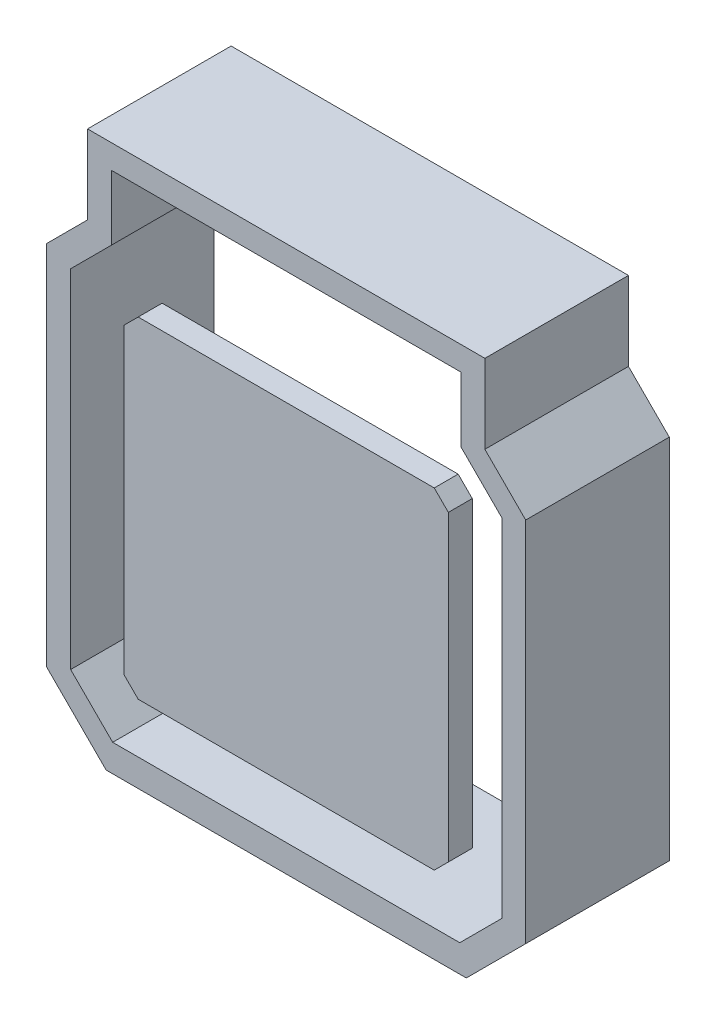
ISO-10303-21;
HEADER;
FILE_DESCRIPTION(('STEP AP214'),'2;1');
FILE_NAME('part.step','',(''),(''),'','','');
FILE_SCHEMA(('AUTOMOTIVE_DESIGN { 1 0 10303 214 1 1 1 1 }'));
ENDSEC;
DATA;
#1=APPLICATION_CONTEXT('core data for automotive mechanical design processes');
#2=APPLICATION_PROTOCOL_DEFINITION('international standard','automotive_design',2000,#1);
#3=PRODUCT_CONTEXT('',#1,'mechanical');
#4=PRODUCT('Part','Part','',(#3));
#5=PRODUCT_RELATED_PRODUCT_CATEGORY('part','',(#4));
#6=PRODUCT_DEFINITION_FORMATION('','',#4);
#7=PRODUCT_DEFINITION_CONTEXT('part definition',#1,'design');
#8=PRODUCT_DEFINITION('design','',#6,#7);
#9=PRODUCT_DEFINITION_SHAPE('','',#8);
#10=(LENGTH_UNIT() NAMED_UNIT(*) SI_UNIT(.MILLI.,.METRE.));
#11=(NAMED_UNIT(*) PLANE_ANGLE_UNIT() SI_UNIT($,.RADIAN.));
#12=(NAMED_UNIT(*) SI_UNIT($,.STERADIAN.) SOLID_ANGLE_UNIT());
#13=UNCERTAINTY_MEASURE_WITH_UNIT(LENGTH_MEASURE(1.E-05),#10,'distance_accuracy_value','');
#14=(GEOMETRIC_REPRESENTATION_CONTEXT(3) GLOBAL_UNCERTAINTY_ASSIGNED_CONTEXT((#13)) GLOBAL_UNIT_ASSIGNED_CONTEXT((#10,
#11,#12)) REPRESENTATION_CONTEXT('',''));
#15=CARTESIAN_POINT('',(0.,0.,0.));
#16=DIRECTION('',(0.,0.,1.));
#17=DIRECTION('',(1.,0.,0.));
#18=AXIS2_PLACEMENT_3D('',#15,#16,#17);
#19=CARTESIAN_POINT('',(0.,0.,0.));
#20=DIRECTION('',(0.,0.,-1.));
#21=DIRECTION('',(-1.,0.,0.));
#22=AXIS2_PLACEMENT_3D('',#19,#20,#21);
#23=PLANE('',#22);
#24=DIRECTION('',(0.,1.,0.));
#25=VECTOR('',#24,1.);
#26=CARTESIAN_POINT('',(30.0265122042927,-23.0001046020526,0.));
#27=LINE('',#26,#25);
#28=CARTESIAN_POINT('',(30.0265122042927,-23.0001046020526,0.));
#29=VERTEX_POINT('',#28);
#30=CARTESIAN_POINT('',(30.0265122042927,23.0001046020527,0.));
#31=VERTEX_POINT('',#30);
#32=EDGE_CURVE('E467',#29,#31,#27,.T.);
#33=ORIENTED_EDGE('',*,*,#32,.T.);
#34=DIRECTION('',(-0.707106781186551,0.707106781186544,0.));
#35=VECTOR('',#34,1.);
#36=CARTESIAN_POINT('',(30.0265122042927,23.0001046020527,0.));
#37=LINE('',#36,#35);
#38=CARTESIAN_POINT('',(24.907301525,28.1193152813454,0.));
#39=VERTEX_POINT('',#38);
#40=EDGE_CURVE('E464',#31,#39,#37,.T.);
#41=ORIENTED_EDGE('',*,*,#40,.T.);
#42=DIRECTION('',(0.,-1.,0.));
#43=VECTOR('',#42,1.);
#44=CARTESIAN_POINT('',(24.907301525,38.,0.));
#45=LINE('',#44,#43);
#46=CARTESIAN_POINT('',(24.907301525,38.,0.));
#47=VERTEX_POINT('',#46);
#48=EDGE_CURVE('E461',#47,#39,#45,.T.);
#49=ORIENTED_EDGE('',*,*,#48,.F.);
#50=DIRECTION('',(1.,0.,0.));
#51=VECTOR('',#50,1.);
#52=CARTESIAN_POINT('',(-24.907301525,38.,0.));
#53=LINE('',#52,#51);
#54=CARTESIAN_POINT('',(-24.907301525,38.,0.));
#55=VERTEX_POINT('',#54);
#56=EDGE_CURVE('E459',#55,#47,#53,.T.);
#57=ORIENTED_EDGE('',*,*,#56,.F.);
#58=DIRECTION('',(0.,1.,0.));
#59=VECTOR('',#58,1.);
#60=CARTESIAN_POINT('',(-24.907301525,28.1193152813457,0.));
#61=LINE('',#60,#59);
#62=CARTESIAN_POINT('',(-24.907301525,28.1193152813457,0.));
#63=VERTEX_POINT('',#62);
#64=EDGE_CURVE('E457',#63,#55,#61,.T.);
#65=ORIENTED_EDGE('',*,*,#64,.F.);
#66=DIRECTION('',(-0.707106781186544,-0.707106781186551,0.));
#67=VECTOR('',#66,1.);
#68=CARTESIAN_POINT('',(-24.907301525,28.1193152813457,0.));
#69=LINE('',#68,#67);
#70=CARTESIAN_POINT('',(-30.0265122042929,23.0001046020527,0.));
#71=VERTEX_POINT('',#70);
#72=EDGE_CURVE('E454',#63,#71,#69,.T.);
#73=ORIENTED_EDGE('',*,*,#72,.T.);
#74=DIRECTION('',(0.,-1.,0.));
#75=VECTOR('',#74,1.);
#76=CARTESIAN_POINT('',(-30.0265122042929,23.0001046020527,0.));
#77=LINE('',#76,#75);
#78=CARTESIAN_POINT('',(-30.0265122042929,-23.0001046020527,0.));
#79=VERTEX_POINT('',#78);
#80=EDGE_CURVE('E451',#71,#79,#77,.T.);
#81=ORIENTED_EDGE('',*,*,#80,.T.);
#82=DIRECTION('',(0.707106781186551,-0.707106781186544,0.));
#83=VECTOR('',#82,1.);
#84=CARTESIAN_POINT('',(-30.0265122042929,-23.0001046020527,0.));
#85=LINE('',#84,#83);
#86=CARTESIAN_POINT('',(-22.5766168063456,-30.45,0.));
#87=VERTEX_POINT('',#86);
#88=EDGE_CURVE('E448',#79,#87,#85,.T.);
#89=ORIENTED_EDGE('',*,*,#88,.T.);
#90=DIRECTION('',(1.,0.,0.));
#91=VECTOR('',#90,1.);
#92=CARTESIAN_POINT('',(-22.5766168063456,-30.45,0.));
#93=LINE('',#92,#91);
#94=CARTESIAN_POINT('',(22.5766168063454,-30.45,0.));
#95=VERTEX_POINT('',#94);
#96=EDGE_CURVE('E445',#87,#95,#93,.T.);
#97=ORIENTED_EDGE('',*,*,#96,.T.);
#98=DIRECTION('',(0.707106781186544,0.707106781186551,0.));
#99=VECTOR('',#98,1.);
#100=CARTESIAN_POINT('',(22.5766168063454,-30.45,0.));
#101=LINE('',#100,#99);
#102=EDGE_CURVE('E423',#95,#29,#101,.T.);
#103=ORIENTED_EDGE('',*,*,#102,.T.);
#104=EDGE_LOOP('',(#33,#41,#49,#57,#65,#73,#81,#89,#97,#103));
#105=FACE_BOUND('',#104,.T.);
#106=DIRECTION('',(-0.707106781186545,-0.70710678118655,0.));
#107=VECTOR('',#106,1.);
#108=CARTESIAN_POINT('',(27.0265122042927,-21.7574639149334,0.));
#109=LINE('',#108,#107);
#110=CARTESIAN_POINT('',(27.0265122042927,-21.7574639149334,0.));
#111=VERTEX_POINT('',#110);
#112=CARTESIAN_POINT('',(21.7574639149342,-27.0265122042919,0.));
#113=VERTEX_POINT('',#112);
#114=EDGE_CURVE('E13',#111,#113,#109,.T.);
#115=ORIENTED_EDGE('',*,*,#114,.T.);
#116=DIRECTION('',(-1.,0.,0.));
#117=VECTOR('',#116,1.);
#118=CARTESIAN_POINT('',(21.7574639149342,-27.0265122042919,0.));
#119=LINE('',#118,#117);
#120=CARTESIAN_POINT('',(-21.7574639149345,-27.0265122042919,0.));
#121=VERTEX_POINT('',#120);
#122=EDGE_CURVE('E221',#113,#121,#119,.T.);
#123=ORIENTED_EDGE('',*,*,#122,.T.);
#124=DIRECTION('',(-0.707106781186542,0.707106781186553,0.));
#125=VECTOR('',#124,1.);
#126=CARTESIAN_POINT('',(-21.7574639149345,-27.0265122042919,0.));
#127=LINE('',#126,#125);
#128=CARTESIAN_POINT('',(-27.0265122042929,-21.7574639149334,0.));
#129=VERTEX_POINT('',#128);
#130=EDGE_CURVE('E351',#121,#129,#127,.T.);
#131=ORIENTED_EDGE('',*,*,#130,.T.);
#132=DIRECTION('',(0.,-1.,0.));
#133=VECTOR('',#132,1.);
#134=CARTESIAN_POINT('',(-27.0265122042929,21.7574639149333,0.));
#135=LINE('',#134,#133);
#136=CARTESIAN_POINT('',(-27.0265122042929,21.7574639149333,0.));
#137=VERTEX_POINT('',#136);
#138=EDGE_CURVE('E505',#137,#129,#135,.T.);
#139=ORIENTED_EDGE('',*,*,#138,.F.);
#140=DIRECTION('',(-0.707106781186533,-0.707106781186562,0.));
#141=VECTOR('',#140,1.);
#142=CARTESIAN_POINT('',(-21.907301525,26.8766745942264,0.));
#143=LINE('',#142,#141);
#144=CARTESIAN_POINT('',(-21.907301525,26.8766745942264,0.));
#145=VERTEX_POINT('',#144);
#146=EDGE_CURVE('E502',#145,#137,#143,.T.);
#147=ORIENTED_EDGE('',*,*,#146,.F.);
#148=DIRECTION('',(0.,1.,0.));
#149=VECTOR('',#148,1.);
#150=CARTESIAN_POINT('',(-21.907301525,26.8766745942264,0.));
#151=LINE('',#150,#149);
#152=CARTESIAN_POINT('',(-21.907301525,35.,0.));
#153=VERTEX_POINT('',#152);
#154=EDGE_CURVE('E499',#145,#153,#151,.T.);
#155=ORIENTED_EDGE('',*,*,#154,.T.);
#156=DIRECTION('',(1.,0.,0.));
#157=VECTOR('',#156,1.);
#158=CARTESIAN_POINT('',(-21.907301525,35.,0.));
#159=LINE('',#158,#157);
#160=CARTESIAN_POINT('',(21.907301525,35.,0.));
#161=VERTEX_POINT('',#160);
#162=EDGE_CURVE('E496',#153,#161,#159,.T.);
#163=ORIENTED_EDGE('',*,*,#162,.T.);
#164=DIRECTION('',(0.,-1.,0.));
#165=VECTOR('',#164,1.);
#166=CARTESIAN_POINT('',(21.907301525,35.,0.));
#167=LINE('',#166,#165);
#168=CARTESIAN_POINT('',(21.907301525,26.8766745942261,0.));
#169=VERTEX_POINT('',#168);
#170=EDGE_CURVE('E493',#161,#169,#167,.T.);
#171=ORIENTED_EDGE('',*,*,#170,.T.);
#172=DIRECTION('',(-0.70710678118655,0.707106781186545,0.));
#173=VECTOR('',#172,1.);
#174=CARTESIAN_POINT('',(27.0265122042927,21.7574639149334,0.));
#175=LINE('',#174,#173);
#176=CARTESIAN_POINT('',(27.0265122042927,21.7574639149334,0.));
#177=VERTEX_POINT('',#176);
#178=EDGE_CURVE('E490',#177,#169,#175,.T.);
#179=ORIENTED_EDGE('',*,*,#178,.F.);
#180=DIRECTION('',(0.,1.,0.));
#181=VECTOR('',#180,1.);
#182=CARTESIAN_POINT('',(27.0265122042927,-21.7574639149334,0.));
#183=LINE('',#182,#181);
#184=EDGE_CURVE('E487',#111,#177,#183,.T.);
#185=ORIENTED_EDGE('',*,*,#184,.F.);
#186=EDGE_LOOP('',(#115,#123,#131,#139,#147,#155,#163,#171,#179,#185));
#187=FACE_BOUND('',#186,.T.);
#188=ADVANCED_FACE('F213',(#105,#187),#23,.F.);
#189=CARTESIAN_POINT('',(30.0265122042927,-23.0001046020526,-3.));
#190=DIRECTION('',(1.,0.,0.));
#191=DIRECTION('',(0.,1.,0.));
#192=AXIS2_PLACEMENT_3D('',#189,#190,#191);
#193=PLANE('',#192);
#194=ORIENTED_EDGE('',*,*,#32,.F.);
#195=DIRECTION('',(0.,0.,1.));
#196=VECTOR('',#195,1.);
#197=CARTESIAN_POINT('',(30.0265122042927,-23.0001046020526,-3.));
#198=LINE('',#197,#196);
#199=CARTESIAN_POINT('',(30.0265122042927,-23.0001046020526,-18.));
#200=VERTEX_POINT('',#199);
#201=EDGE_CURVE('E420',#200,#29,#198,.T.);
#202=ORIENTED_EDGE('',*,*,#201,.F.);
#203=DIRECTION('',(0.,-1.,0.));
#204=VECTOR('',#203,1.);
#205=CARTESIAN_POINT('',(30.0265122042927,0.,-18.));
#206=LINE('',#205,#204);
#207=CARTESIAN_POINT('',(30.0265122042927,23.0001046020527,-18.));
#208=VERTEX_POINT('',#207);
#209=EDGE_CURVE('E393',#208,#200,#206,.T.);
#210=ORIENTED_EDGE('',*,*,#209,.F.);
#211=DIRECTION('',(0.,0.,1.));
#212=VECTOR('',#211,1.);
#213=CARTESIAN_POINT('',(30.0265122042927,23.0001046020527,-3.));
#214=LINE('',#213,#212);
#215=EDGE_CURVE('E421',#208,#31,#214,.T.);
#216=ORIENTED_EDGE('',*,*,#215,.T.);
#217=EDGE_LOOP('',(#194,#202,#210,#216));
#218=FACE_BOUND('',#217,.T.);
#219=ADVANCED_FACE('F546',(#218),#193,.T.);
#220=CARTESIAN_POINT('',(22.5766168063454,-30.45,-3.));
#221=DIRECTION('',(0.707106781186551,-0.707106781186544,0.));
#222=DIRECTION('',(0.707106781186544,0.707106781186551,0.));
#223=AXIS2_PLACEMENT_3D('',#220,#221,#222);
#224=PLANE('',#223);
#225=ORIENTED_EDGE('',*,*,#102,.F.);
#226=DIRECTION('',(0.,0.,1.));
#227=VECTOR('',#226,1.);
#228=CARTESIAN_POINT('',(22.5766168063454,-30.45,-3.));
#229=LINE('',#228,#227);
#230=CARTESIAN_POINT('',(22.5766168063454,-30.45,-18.));
#231=VERTEX_POINT('',#230);
#232=EDGE_CURVE('E440',#231,#95,#229,.T.);
#233=ORIENTED_EDGE('',*,*,#232,.F.);
#234=DIRECTION('',(-0.707106781186544,-0.707106781186551,0.));
#235=VECTOR('',#234,1.);
#236=CARTESIAN_POINT('',(26.5133084031728,-26.5133084031726,-18.));
#237=LINE('',#236,#235);
#238=EDGE_CURVE('E396',#200,#231,#237,.T.);
#239=ORIENTED_EDGE('',*,*,#238,.F.);
#240=ORIENTED_EDGE('',*,*,#201,.T.);
#241=EDGE_LOOP('',(#225,#233,#239,#240));
#242=FACE_BOUND('',#241,.T.);
#243=ADVANCED_FACE('F552',(#242),#224,.T.);
#244=CARTESIAN_POINT('',(-22.5766168063456,-30.45,-3.));
#245=DIRECTION('',(0.,-1.,0.));
#246=DIRECTION('',(1.,0.,0.));
#247=AXIS2_PLACEMENT_3D('',#244,#245,#246);
#248=PLANE('',#247);
#249=ORIENTED_EDGE('',*,*,#96,.F.);
#250=DIRECTION('',(0.,0.,1.));
#251=VECTOR('',#250,1.);
#252=CARTESIAN_POINT('',(-22.5766168063456,-30.45,-3.));
#253=LINE('',#252,#251);
#254=CARTESIAN_POINT('',(-22.5766168063456,-30.45,-18.));
#255=VERTEX_POINT('',#254);
#256=EDGE_CURVE('E438',#255,#87,#253,.T.);
#257=ORIENTED_EDGE('',*,*,#256,.F.);
#258=DIRECTION('',(-1.,0.,0.));
#259=VECTOR('',#258,1.);
#260=CARTESIAN_POINT('',(0.,-30.45,-18.));
#261=LINE('',#260,#259);
#262=EDGE_CURVE('E399',#231,#255,#261,.T.);
#263=ORIENTED_EDGE('',*,*,#262,.F.);
#264=ORIENTED_EDGE('',*,*,#232,.T.);
#265=EDGE_LOOP('',(#249,#257,#263,#264));
#266=FACE_BOUND('',#265,.T.);
#267=ADVANCED_FACE('F664',(#266),#248,.T.);
#268=CARTESIAN_POINT('',(-30.0265122042929,-23.0001046020527,-3.));
#269=DIRECTION('',(-0.707106781186544,-0.70710678118655,0.));
#270=DIRECTION('',(0.707106781186551,-0.707106781186545,0.));
#271=AXIS2_PLACEMENT_3D('',#268,#269,#270);
#272=PLANE('',#271);
#273=ORIENTED_EDGE('',*,*,#88,.F.);
#274=DIRECTION('',(0.,0.,1.));
#275=VECTOR('',#274,1.);
#276=CARTESIAN_POINT('',(-30.0265122042929,-23.0001046020527,-3.));
#277=LINE('',#276,#275);
#278=CARTESIAN_POINT('',(-30.0265122042929,-23.0001046020527,-18.));
#279=VERTEX_POINT('',#278);
#280=EDGE_CURVE('E436',#279,#79,#277,.T.);
#281=ORIENTED_EDGE('',*,*,#280,.F.);
#282=DIRECTION('',(-0.707106781186551,0.707106781186544,0.));
#283=VECTOR('',#282,1.);
#284=CARTESIAN_POINT('',(-26.5133084031727,-26.5133084031729,-18.));
#285=LINE('',#284,#283);
#286=EDGE_CURVE('E402',#255,#279,#285,.T.);
#287=ORIENTED_EDGE('',*,*,#286,.F.);
#288=ORIENTED_EDGE('',*,*,#256,.T.);
#289=EDGE_LOOP('',(#273,#281,#287,#288));
#290=FACE_BOUND('',#289,.T.);
#291=ADVANCED_FACE('F661',(#290),#272,.T.);
#292=CARTESIAN_POINT('',(-30.0265122042929,23.0001046020527,-3.));
#293=DIRECTION('',(-1.,0.,0.));
#294=DIRECTION('',(0.,0.,1.));
#295=AXIS2_PLACEMENT_3D('',#292,#293,#294);
#296=PLANE('',#295);
#297=ORIENTED_EDGE('',*,*,#80,.F.);
#298=DIRECTION('',(0.,0.,1.));
#299=VECTOR('',#298,1.);
#300=CARTESIAN_POINT('',(-30.0265122042929,23.0001046020527,-3.));
#301=LINE('',#300,#299);
#302=CARTESIAN_POINT('',(-30.0265122042929,23.0001046020527,-18.));
#303=VERTEX_POINT('',#302);
#304=EDGE_CURVE('E434',#303,#71,#301,.T.);
#305=ORIENTED_EDGE('',*,*,#304,.F.);
#306=DIRECTION('',(0.,1.,0.));
#307=VECTOR('',#306,1.);
#308=CARTESIAN_POINT('',(-30.0265122042929,0.,-18.));
#309=LINE('',#308,#307);
#310=EDGE_CURVE('E405',#279,#303,#309,.T.);
#311=ORIENTED_EDGE('',*,*,#310,.F.);
#312=ORIENTED_EDGE('',*,*,#280,.T.);
#313=EDGE_LOOP('',(#297,#305,#311,#312));
#314=FACE_BOUND('',#313,.T.);
#315=ADVANCED_FACE('F657',(#314),#296,.T.);
#316=CARTESIAN_POINT('',(-24.907301525,28.1193152813457,-3.));
#317=DIRECTION('',(-0.707106781186551,0.707106781186544,0.));
#318=DIRECTION('',(-0.707106781186544,-0.707106781186551,0.));
#319=AXIS2_PLACEMENT_3D('',#316,#317,#318);
#320=PLANE('',#319);
#321=ORIENTED_EDGE('',*,*,#72,.F.);
#322=DIRECTION('',(0.,0.,1.));
#323=VECTOR('',#322,1.);
#324=CARTESIAN_POINT('',(-24.907301525,28.1193152813457,-3.));
#325=LINE('',#324,#323);
#326=CARTESIAN_POINT('',(-24.907301525,28.1193152813457,-18.));
#327=VERTEX_POINT('',#326);
#328=EDGE_CURVE('E432',#327,#63,#325,.T.);
#329=ORIENTED_EDGE('',*,*,#328,.F.);
#330=DIRECTION('',(0.707106781186544,0.707106781186551,0.));
#331=VECTOR('',#330,1.);
#332=CARTESIAN_POINT('',(-26.513308403173,26.5133084031727,-18.));
#333=LINE('',#332,#331);
#334=EDGE_CURVE('E408',#303,#327,#333,.T.);
#335=ORIENTED_EDGE('',*,*,#334,.F.);
#336=ORIENTED_EDGE('',*,*,#304,.T.);
#337=EDGE_LOOP('',(#321,#329,#335,#336));
#338=FACE_BOUND('',#337,.T.);
#339=ADVANCED_FACE('F653',(#338),#320,.T.);
#340=CARTESIAN_POINT('',(-24.907301525,28.1193152813457,-3.));
#341=DIRECTION('',(1.,0.,0.));
#342=DIRECTION('',(0.,0.,-1.));
#343=AXIS2_PLACEMENT_3D('',#340,#341,#342);
#344=PLANE('',#343);
#345=ORIENTED_EDGE('',*,*,#64,.T.);
#346=DIRECTION('',(0.,0.,1.));
#347=VECTOR('',#346,1.);
#348=CARTESIAN_POINT('',(-24.907301525,38.,-3.));
#349=LINE('',#348,#347);
#350=CARTESIAN_POINT('',(-24.907301525,38.,-18.));
#351=VERTEX_POINT('',#350);
#352=EDGE_CURVE('E429',#351,#55,#349,.T.);
#353=ORIENTED_EDGE('',*,*,#352,.F.);
#354=DIRECTION('',(0.,1.,0.));
#355=VECTOR('',#354,1.);
#356=CARTESIAN_POINT('',(-24.907301525,0.,-18.));
#357=LINE('',#356,#355);
#358=EDGE_CURVE('E411',#327,#351,#357,.T.);
#359=ORIENTED_EDGE('',*,*,#358,.F.);
#360=ORIENTED_EDGE('',*,*,#328,.T.);
#361=EDGE_LOOP('',(#345,#353,#359,#360));
#362=FACE_BOUND('',#361,.T.);
#363=ADVANCED_FACE('F649',(#362),#344,.F.);
#364=CARTESIAN_POINT('',(-24.907301525,38.,-3.));
#365=DIRECTION('',(0.,-1.,0.));
#366=DIRECTION('',(1.,0.,0.));
#367=AXIS2_PLACEMENT_3D('',#364,#365,#366);
#368=PLANE('',#367);
#369=ORIENTED_EDGE('',*,*,#56,.T.);
#370=DIRECTION('',(0.,0.,1.));
#371=VECTOR('',#370,1.);
#372=CARTESIAN_POINT('',(24.907301525,38.,-3.));
#373=LINE('',#372,#371);
#374=CARTESIAN_POINT('',(24.907301525,38.,-18.));
#375=VERTEX_POINT('',#374);
#376=EDGE_CURVE('E426',#375,#47,#373,.T.);
#377=ORIENTED_EDGE('',*,*,#376,.F.);
#378=DIRECTION('',(1.,0.,0.));
#379=VECTOR('',#378,1.);
#380=CARTESIAN_POINT('',(0.,38.,-18.));
#381=LINE('',#380,#379);
#382=EDGE_CURVE('E414',#351,#375,#381,.T.);
#383=ORIENTED_EDGE('',*,*,#382,.F.);
#384=ORIENTED_EDGE('',*,*,#352,.T.);
#385=EDGE_LOOP('',(#369,#377,#383,#384));
#386=FACE_BOUND('',#385,.T.);
#387=ADVANCED_FACE('F645',(#386),#368,.F.);
#388=CARTESIAN_POINT('',(24.907301525,38.,-3.));
#389=DIRECTION('',(-1.,0.,0.));
#390=DIRECTION('',(0.,0.,1.));
#391=AXIS2_PLACEMENT_3D('',#388,#389,#390);
#392=PLANE('',#391);
#393=ORIENTED_EDGE('',*,*,#48,.T.);
#394=DIRECTION('',(0.,0.,1.));
#395=VECTOR('',#394,1.);
#396=CARTESIAN_POINT('',(24.907301525,28.1193152813454,-3.));
#397=LINE('',#396,#395);
#398=CARTESIAN_POINT('',(24.907301525,28.1193152813454,-18.));
#399=VERTEX_POINT('',#398);
#400=EDGE_CURVE('E424',#399,#39,#397,.T.);
#401=ORIENTED_EDGE('',*,*,#400,.F.);
#402=DIRECTION('',(0.,-1.,0.));
#403=VECTOR('',#402,1.);
#404=CARTESIAN_POINT('',(24.907301525,0.,-18.));
#405=LINE('',#404,#403);
#406=EDGE_CURVE('E417',#375,#399,#405,.T.);
#407=ORIENTED_EDGE('',*,*,#406,.F.);
#408=ORIENTED_EDGE('',*,*,#376,.T.);
#409=EDGE_LOOP('',(#393,#401,#407,#408));
#410=FACE_BOUND('',#409,.T.);
#411=ADVANCED_FACE('F641',(#410),#392,.F.);
#412=CARTESIAN_POINT('',(30.0265122042927,23.0001046020527,-3.));
#413=DIRECTION('',(0.707106781186544,0.707106781186551,0.));
#414=DIRECTION('',(-0.707106781186551,0.707106781186544,0.));
#415=AXIS2_PLACEMENT_3D('',#412,#413,#414);
#416=PLANE('',#415);
#417=ORIENTED_EDGE('',*,*,#40,.F.);
#418=ORIENTED_EDGE('',*,*,#215,.F.);
#419=DIRECTION('',(0.707106781186551,-0.707106781186544,0.));
#420=VECTOR('',#419,1.);
#421=CARTESIAN_POINT('',(26.5133084031726,26.5133084031728,-18.));
#422=LINE('',#421,#420);
#423=EDGE_CURVE('E390',#399,#208,#422,.T.);
#424=ORIENTED_EDGE('',*,*,#423,.F.);
#425=ORIENTED_EDGE('',*,*,#400,.T.);
#426=EDGE_LOOP('',(#417,#418,#424,#425));
#427=FACE_BOUND('',#426,.T.);
#428=ADVANCED_FACE('F560',(#427),#416,.T.);
#429=CARTESIAN_POINT('',(27.0265122042927,-21.7574639149334,-3.));
#430=DIRECTION('',(-0.70710678118655,0.707106781186545,0.));
#431=DIRECTION('',(-0.707106781186545,-0.70710678118655,0.));
#432=AXIS2_PLACEMENT_3D('',#429,#430,#431);
#433=PLANE('',#432);
#434=ORIENTED_EDGE('',*,*,#114,.F.);
#435=DIRECTION('',(0.,0.,1.));
#436=VECTOR('',#435,1.);
#437=CARTESIAN_POINT('',(27.0265122042927,-21.7574639149334,-3.));
#438=LINE('',#437,#436);
#439=CARTESIAN_POINT('',(27.0265122042927,-21.7574639149334,-18.));
#440=VERTEX_POINT('',#439);
#441=EDGE_CURVE('E484',#440,#111,#438,.T.);
#442=ORIENTED_EDGE('',*,*,#441,.F.);
#443=DIRECTION('',(0.707106781186545,0.70710678118655,0.));
#444=VECTOR('',#443,1.);
#445=CARTESIAN_POINT('',(24.3919880596131,-24.391988059613,-18.));
#446=LINE('',#445,#444);
#447=CARTESIAN_POINT('',(21.7574639149342,-27.0265122042919,-18.));
#448=VERTEX_POINT('',#447);
#449=EDGE_CURVE('E361',#448,#440,#446,.T.);
#450=ORIENTED_EDGE('',*,*,#449,.F.);
#451=DIRECTION('',(0.,0.,1.));
#452=VECTOR('',#451,1.);
#453=CARTESIAN_POINT('',(21.7574639149342,-27.0265122042919,-3.));
#454=LINE('',#453,#452);
#455=EDGE_CURVE('E353',#448,#113,#454,.T.);
#456=ORIENTED_EDGE('',*,*,#455,.T.);
#457=EDGE_LOOP('',(#434,#442,#450,#456));
#458=FACE_BOUND('',#457,.T.);
#459=ADVANCED_FACE('F513',(#458),#433,.T.);
#460=CARTESIAN_POINT('',(21.7574639149342,-27.0265122042919,-3.));
#461=DIRECTION('',(0.,1.,0.));
#462=DIRECTION('',(0.,0.,1.));
#463=AXIS2_PLACEMENT_3D('',#460,#461,#462);
#464=PLANE('',#463);
#465=ORIENTED_EDGE('',*,*,#122,.F.);
#466=ORIENTED_EDGE('',*,*,#455,.F.);
#467=DIRECTION('',(1.,0.,0.));
#468=VECTOR('',#467,1.);
#469=CARTESIAN_POINT('',(0.,-27.0265122042919,-18.));
#470=LINE('',#469,#468);
#471=CARTESIAN_POINT('',(-21.7574639149345,-27.0265122042919,-18.));
#472=VERTEX_POINT('',#471);
#473=EDGE_CURVE('E356',#472,#448,#470,.T.);
#474=ORIENTED_EDGE('',*,*,#473,.F.);
#475=DIRECTION('',(0.,0.,1.));
#476=VECTOR('',#475,1.);
#477=CARTESIAN_POINT('',(-21.7574639149345,-27.0265122042919,-3.));
#478=LINE('',#477,#476);
#479=EDGE_CURVE('E232',#472,#121,#478,.T.);
#480=ORIENTED_EDGE('',*,*,#479,.T.);
#481=EDGE_LOOP('',(#465,#466,#474,#480));
#482=FACE_BOUND('',#481,.T.);
#483=ADVANCED_FACE('F357',(#482),#464,.T.);
#484=CARTESIAN_POINT('',(-21.7574639149345,-27.0265122042919,-3.));
#485=DIRECTION('',(0.707106781186553,0.707106781186542,0.));
#486=DIRECTION('',(-0.707106781186542,0.707106781186553,0.));
#487=AXIS2_PLACEMENT_3D('',#484,#485,#486);
#488=PLANE('',#487);
#489=ORIENTED_EDGE('',*,*,#130,.F.);
#490=ORIENTED_EDGE('',*,*,#479,.F.);
#491=DIRECTION('',(0.707106781186542,-0.707106781186553,0.));
#492=VECTOR('',#491,1.);
#493=CARTESIAN_POINT('',(-24.3919880596134,-24.391988059613,-18.));
#494=LINE('',#493,#492);
#495=CARTESIAN_POINT('',(-27.0265122042929,-21.7574639149334,-18.));
#496=VERTEX_POINT('',#495);
#497=EDGE_CURVE('E349',#496,#472,#494,.T.);
#498=ORIENTED_EDGE('',*,*,#497,.F.);
#499=DIRECTION('',(0.,0.,1.));
#500=VECTOR('',#499,1.);
#501=CARTESIAN_POINT('',(-27.0265122042929,-21.7574639149334,-3.));
#502=LINE('',#501,#500);
#503=EDGE_CURVE('E352',#496,#129,#502,.T.);
#504=ORIENTED_EDGE('',*,*,#503,.T.);
#505=EDGE_LOOP('',(#489,#490,#498,#504));
#506=FACE_BOUND('',#505,.T.);
#507=ADVANCED_FACE('F347',(#506),#488,.T.);
#508=CARTESIAN_POINT('',(-27.0265122042929,21.7574639149333,-3.));
#509=DIRECTION('',(-1.,0.,0.));
#510=DIRECTION('',(0.,0.,1.));
#511=AXIS2_PLACEMENT_3D('',#508,#509,#510);
#512=PLANE('',#511);
#513=ORIENTED_EDGE('',*,*,#138,.T.);
#514=ORIENTED_EDGE('',*,*,#503,.F.);
#515=DIRECTION('',(0.,-1.,0.));
#516=VECTOR('',#515,1.);
#517=CARTESIAN_POINT('',(-27.0265122042929,0.,-18.));
#518=LINE('',#517,#516);
#519=CARTESIAN_POINT('',(-27.0265122042929,21.7574639149333,-18.));
#520=VERTEX_POINT('',#519);
#521=EDGE_CURVE('E368',#520,#496,#518,.T.);
#522=ORIENTED_EDGE('',*,*,#521,.F.);
#523=DIRECTION('',(0.,0.,1.));
#524=VECTOR('',#523,1.);
#525=CARTESIAN_POINT('',(-27.0265122042929,21.7574639149333,-3.));
#526=LINE('',#525,#524);
#527=EDGE_CURVE('E472',#520,#137,#526,.T.);
#528=ORIENTED_EDGE('',*,*,#527,.T.);
#529=EDGE_LOOP('',(#513,#514,#522,#528));
#530=FACE_BOUND('',#529,.T.);
#531=ADVANCED_FACE('F536',(#530),#512,.F.);
#532=CARTESIAN_POINT('',(-21.907301525,26.8766745942264,-3.));
#533=DIRECTION('',(-0.707106781186562,0.707106781186533,0.));
#534=DIRECTION('',(-0.707106781186533,-0.707106781186562,0.));
#535=AXIS2_PLACEMENT_3D('',#532,#533,#534);
#536=PLANE('',#535);
#537=ORIENTED_EDGE('',*,*,#146,.T.);
#538=ORIENTED_EDGE('',*,*,#527,.F.);
#539=DIRECTION('',(-0.707106781186533,-0.707106781186562,0.));
#540=VECTOR('',#539,1.);
#541=CARTESIAN_POINT('',(-24.3919880596137,24.3919880596127,-18.));
#542=LINE('',#541,#540);
#543=CARTESIAN_POINT('',(-21.907301525,26.8766745942264,-18.));
#544=VERTEX_POINT('',#543);
#545=EDGE_CURVE('E387',#544,#520,#542,.T.);
#546=ORIENTED_EDGE('',*,*,#545,.F.);
#547=DIRECTION('',(0.,0.,1.));
#548=VECTOR('',#547,1.);
#549=CARTESIAN_POINT('',(-21.907301525,26.8766745942264,-3.));
#550=LINE('',#549,#548);
#551=EDGE_CURVE('E474',#544,#145,#550,.T.);
#552=ORIENTED_EDGE('',*,*,#551,.T.);
#553=EDGE_LOOP('',(#537,#538,#546,#552));
#554=FACE_BOUND('',#553,.T.);
#555=ADVANCED_FACE('F534',(#554),#536,.F.);
#556=CARTESIAN_POINT('',(-21.907301525,26.8766745942264,-3.));
#557=DIRECTION('',(1.,0.,0.));
#558=DIRECTION('',(0.,0.,-1.));
#559=AXIS2_PLACEMENT_3D('',#556,#557,#558);
#560=PLANE('',#559);
#561=ORIENTED_EDGE('',*,*,#154,.F.);
#562=ORIENTED_EDGE('',*,*,#551,.F.);
#563=DIRECTION('',(0.,-1.,0.));
#564=VECTOR('',#563,1.);
#565=CARTESIAN_POINT('',(-21.907301525,0.,-18.));
#566=LINE('',#565,#564);
#567=CARTESIAN_POINT('',(-21.907301525,35.,-18.));
#568=VERTEX_POINT('',#567);
#569=EDGE_CURVE('E384',#568,#544,#566,.T.);
#570=ORIENTED_EDGE('',*,*,#569,.F.);
#571=DIRECTION('',(0.,0.,1.));
#572=VECTOR('',#571,1.);
#573=CARTESIAN_POINT('',(-21.907301525,35.,-3.));
#574=LINE('',#573,#572);
#575=EDGE_CURVE('E476',#568,#153,#574,.T.);
#576=ORIENTED_EDGE('',*,*,#575,.T.);
#577=EDGE_LOOP('',(#561,#562,#570,#576));
#578=FACE_BOUND('',#577,.T.);
#579=ADVANCED_FACE('F530',(#578),#560,.T.);
#580=CARTESIAN_POINT('',(-21.907301525,35.,-3.));
#581=DIRECTION('',(0.,-1.,0.));
#582=DIRECTION('',(1.,0.,0.));
#583=AXIS2_PLACEMENT_3D('',#580,#581,#582);
#584=PLANE('',#583);
#585=ORIENTED_EDGE('',*,*,#162,.F.);
#586=ORIENTED_EDGE('',*,*,#575,.F.);
#587=DIRECTION('',(-1.,0.,0.));
#588=VECTOR('',#587,1.);
#589=CARTESIAN_POINT('',(0.,35.,-18.));
#590=LINE('',#589,#588);
#591=CARTESIAN_POINT('',(21.907301525,35.,-18.));
#592=VERTEX_POINT('',#591);
#593=EDGE_CURVE('E381',#592,#568,#590,.T.);
#594=ORIENTED_EDGE('',*,*,#593,.F.);
#595=DIRECTION('',(0.,0.,1.));
#596=VECTOR('',#595,1.);
#597=CARTESIAN_POINT('',(21.907301525,35.,-3.));
#598=LINE('',#597,#596);
#599=EDGE_CURVE('E478',#592,#161,#598,.T.);
#600=ORIENTED_EDGE('',*,*,#599,.T.);
#601=EDGE_LOOP('',(#585,#586,#594,#600));
#602=FACE_BOUND('',#601,.T.);
#603=ADVANCED_FACE('F527',(#602),#584,.T.);
#604=CARTESIAN_POINT('',(21.907301525,35.,-3.));
#605=DIRECTION('',(-1.,0.,0.));
#606=DIRECTION('',(0.,0.,1.));
#607=AXIS2_PLACEMENT_3D('',#604,#605,#606);
#608=PLANE('',#607);
#609=ORIENTED_EDGE('',*,*,#170,.F.);
#610=ORIENTED_EDGE('',*,*,#599,.F.);
#611=DIRECTION('',(0.,1.,0.));
#612=VECTOR('',#611,1.);
#613=CARTESIAN_POINT('',(21.907301525,0.,-18.));
#614=LINE('',#613,#612);
#615=CARTESIAN_POINT('',(21.907301525,26.8766745942261,-18.));
#616=VERTEX_POINT('',#615);
#617=EDGE_CURVE('E378',#616,#592,#614,.T.);
#618=ORIENTED_EDGE('',*,*,#617,.F.);
#619=DIRECTION('',(0.,0.,1.));
#620=VECTOR('',#619,1.);
#621=CARTESIAN_POINT('',(21.907301525,26.8766745942261,-3.));
#622=LINE('',#621,#620);
#623=EDGE_CURVE('E480',#616,#169,#622,.T.);
#624=ORIENTED_EDGE('',*,*,#623,.T.);
#625=EDGE_LOOP('',(#609,#610,#618,#624));
#626=FACE_BOUND('',#625,.T.);
#627=ADVANCED_FACE('F522',(#626),#608,.T.);
#628=CARTESIAN_POINT('',(27.0265122042927,21.7574639149334,-3.));
#629=DIRECTION('',(0.707106781186545,0.70710678118655,0.));
#630=DIRECTION('',(-0.70710678118655,0.707106781186545,0.));
#631=AXIS2_PLACEMENT_3D('',#628,#629,#630);
#632=PLANE('',#631);
#633=ORIENTED_EDGE('',*,*,#178,.T.);
#634=ORIENTED_EDGE('',*,*,#623,.F.);
#635=DIRECTION('',(-0.70710678118655,0.707106781186545,0.));
#636=VECTOR('',#635,1.);
#637=CARTESIAN_POINT('',(24.391988059613,24.3919880596131,-18.));
#638=LINE('',#637,#636);
#639=CARTESIAN_POINT('',(27.0265122042927,21.7574639149334,-18.));
#640=VERTEX_POINT('',#639);
#641=EDGE_CURVE('E375',#640,#616,#638,.T.);
#642=ORIENTED_EDGE('',*,*,#641,.F.);
#643=DIRECTION('',(0.,0.,1.));
#644=VECTOR('',#643,1.);
#645=CARTESIAN_POINT('',(27.0265122042927,21.7574639149334,-3.));
#646=LINE('',#645,#644);
#647=EDGE_CURVE('E482',#640,#177,#646,.T.);
#648=ORIENTED_EDGE('',*,*,#647,.T.);
#649=EDGE_LOOP('',(#633,#634,#642,#648));
#650=FACE_BOUND('',#649,.T.);
#651=ADVANCED_FACE('F519',(#650),#632,.F.);
#652=CARTESIAN_POINT('',(27.0265122042927,-21.7574639149334,-3.));
#653=DIRECTION('',(1.,0.,0.));
#654=DIRECTION('',(0.,0.,-1.));
#655=AXIS2_PLACEMENT_3D('',#652,#653,#654);
#656=PLANE('',#655);
#657=ORIENTED_EDGE('',*,*,#184,.T.);
#658=ORIENTED_EDGE('',*,*,#647,.F.);
#659=DIRECTION('',(0.,1.,0.));
#660=VECTOR('',#659,1.);
#661=CARTESIAN_POINT('',(27.0265122042927,0.,-18.));
#662=LINE('',#661,#660);
#663=EDGE_CURVE('E372',#440,#640,#662,.T.);
#664=ORIENTED_EDGE('',*,*,#663,.F.);
#665=ORIENTED_EDGE('',*,*,#441,.T.);
#666=EDGE_LOOP('',(#657,#658,#664,#665));
#667=FACE_BOUND('',#666,.T.);
#668=ADVANCED_FACE('F215',(#667),#656,.F.);
#669=CARTESIAN_POINT('',(0.,0.,-18.));
#670=DIRECTION('',(0.,0.,-1.));
#671=DIRECTION('',(-1.,0.,0.));
#672=AXIS2_PLACEMENT_3D('',#669,#670,#671);
#673=PLANE('',#672);
#674=ORIENTED_EDGE('',*,*,#497,.T.);
#675=ORIENTED_EDGE('',*,*,#473,.T.);
#676=ORIENTED_EDGE('',*,*,#449,.T.);
#677=ORIENTED_EDGE('',*,*,#663,.T.);
#678=ORIENTED_EDGE('',*,*,#641,.T.);
#679=ORIENTED_EDGE('',*,*,#617,.T.);
#680=ORIENTED_EDGE('',*,*,#593,.T.);
#681=ORIENTED_EDGE('',*,*,#569,.T.);
#682=ORIENTED_EDGE('',*,*,#545,.T.);
#683=ORIENTED_EDGE('',*,*,#521,.T.);
#684=EDGE_LOOP('',(#674,#675,#676,#677,#678,#679,#680,#681,#682,#683));
#685=FACE_BOUND('',#684,.T.);
#686=ORIENTED_EDGE('',*,*,#423,.T.);
#687=ORIENTED_EDGE('',*,*,#209,.T.);
#688=ORIENTED_EDGE('',*,*,#238,.T.);
#689=ORIENTED_EDGE('',*,*,#262,.T.);
#690=ORIENTED_EDGE('',*,*,#286,.T.);
#691=ORIENTED_EDGE('',*,*,#310,.T.);
#692=ORIENTED_EDGE('',*,*,#334,.T.);
#693=ORIENTED_EDGE('',*,*,#358,.T.);
#694=ORIENTED_EDGE('',*,*,#382,.T.);
#695=ORIENTED_EDGE('',*,*,#406,.T.);
#696=EDGE_LOOP('',(#686,#687,#688,#689,#690,#691,#692,#693,#694,#695));
#697=FACE_BOUND('',#696,.T.);
#698=ADVANCED_FACE('F364',(#685,#697),#673,.T.);
#699=CLOSED_SHELL('',(#188,#219,#243,#267,#291,#315,#339,#363,#387,#411,#428,#459,#483,#507,
#531,#555,#579,#603,#627,#651,#668,#698));
#700=MANIFOLD_SOLID_BREP('B2',#699);
#701=CARTESIAN_POINT('',(19.6543726256631,19.6543726256633,-3.));
#702=DIRECTION('',(0.707106781186544,0.707106781186551,0.));
#703=DIRECTION('',(-0.707106781186551,0.707106781186544,0.));
#704=AXIS2_PLACEMENT_3D('',#701,#702,#703);
#705=PLANE('',#704);
#706=DIRECTION('',(-0.707106781186551,0.707106781186544,0.));
#707=VECTOR('',#706,1.);
#708=CARTESIAN_POINT('',(19.6543726256631,19.6543726256633,0.));
#709=LINE('',#708,#707);
#710=CARTESIAN_POINT('',(20.3265122042927,18.9822330470336,0.));
#711=VERTEX_POINT('',#710);
#712=CARTESIAN_POINT('',(18.5587452513263,20.75,0.));
#713=VERTEX_POINT('',#712);
#714=EDGE_CURVE('E1002',#711,#713,#709,.T.);
#715=ORIENTED_EDGE('',*,*,#714,.F.);
#716=DIRECTION('',(0.,0.,1.));
#717=VECTOR('',#716,1.);
#718=CARTESIAN_POINT('',(20.3265122042927,18.9822330470336,-3.));
#719=LINE('',#718,#717);
#720=CARTESIAN_POINT('',(20.3265122042927,18.9822330470336,-3.));
#721=VERTEX_POINT('',#720);
#722=EDGE_CURVE('E211',#721,#711,#719,.T.);
#723=ORIENTED_EDGE('',*,*,#722,.F.);
#724=DIRECTION('',(-0.707106781186551,0.707106781186544,0.));
#725=VECTOR('',#724,1.);
#726=CARTESIAN_POINT('',(19.6543726256631,19.6543726256633,-3.));
#727=LINE('',#726,#725);
#728=CARTESIAN_POINT('',(18.5587452513263,20.75,-3.));
#729=VERTEX_POINT('',#728);
#730=EDGE_CURVE('E1022',#721,#729,#727,.T.);
#731=ORIENTED_EDGE('',*,*,#730,.T.);
#732=DIRECTION('',(0.,0.,1.));
#733=VECTOR('',#732,1.);
#734=CARTESIAN_POINT('',(18.5587452513263,20.75,-3.));
#735=LINE('',#734,#733);
#736=EDGE_CURVE('E908',#729,#713,#735,.T.);
#737=ORIENTED_EDGE('',*,*,#736,.T.);
#738=EDGE_LOOP('',(#715,#723,#731,#737));
#739=FACE_BOUND('',#738,.T.);
#740=ADVANCED_FACE('F905',(#739),#705,.T.);
#741=CARTESIAN_POINT('',(20.3265122042927,0.,-3.));
#742=DIRECTION('',(1.,0.,0.));
#743=DIRECTION('',(0.,1.,0.));
#744=AXIS2_PLACEMENT_3D('',#741,#742,#743);
#745=PLANE('',#744);
#746=DIRECTION('',(0.,1.,0.));
#747=VECTOR('',#746,1.);
#748=CARTESIAN_POINT('',(20.3265122042927,0.,0.));
#749=LINE('',#748,#747);
#750=CARTESIAN_POINT('',(20.3265122042927,-18.9822330470336,0.));
#751=VERTEX_POINT('',#750);
#752=EDGE_CURVE('E1020',#751,#711,#749,.T.);
#753=ORIENTED_EDGE('',*,*,#752,.F.);
#754=DIRECTION('',(0.,0.,1.));
#755=VECTOR('',#754,1.);
#756=CARTESIAN_POINT('',(20.3265122042927,-18.9822330470336,-3.));
#757=LINE('',#756,#755);
#758=CARTESIAN_POINT('',(20.3265122042927,-18.9822330470336,-3.));
#759=VERTEX_POINT('',#758);
#760=EDGE_CURVE('E914',#759,#751,#757,.T.);
#761=ORIENTED_EDGE('',*,*,#760,.F.);
#762=DIRECTION('',(0.,1.,0.));
#763=VECTOR('',#762,1.);
#764=CARTESIAN_POINT('',(20.3265122042927,0.,-3.));
#765=LINE('',#764,#763);
#766=EDGE_CURVE('E992',#759,#721,#765,.T.);
#767=ORIENTED_EDGE('',*,*,#766,.T.);
#768=ORIENTED_EDGE('',*,*,#722,.T.);
#769=EDGE_LOOP('',(#753,#761,#767,#768));
#770=FACE_BOUND('',#769,.T.);
#771=ADVANCED_FACE('F1034',(#770),#745,.T.);
#772=CARTESIAN_POINT('',(19.6543726256633,-19.6543726256631,-3.));
#773=DIRECTION('',(0.707106781186551,-0.707106781186544,0.));
#774=DIRECTION('',(0.707106781186544,0.707106781186551,0.));
#775=AXIS2_PLACEMENT_3D('',#772,#773,#774);
#776=PLANE('',#775);
#777=DIRECTION('',(0.707106781186544,0.707106781186551,0.));
#778=VECTOR('',#777,1.);
#779=CARTESIAN_POINT('',(19.6543726256633,-19.6543726256631,0.));
#780=LINE('',#779,#778);
#781=CARTESIAN_POINT('',(18.5587452513264,-20.75,0.));
#782=VERTEX_POINT('',#781);
#783=EDGE_CURVE('E979',#782,#751,#780,.T.);
#784=ORIENTED_EDGE('',*,*,#783,.F.);
#785=DIRECTION('',(0.,0.,1.));
#786=VECTOR('',#785,1.);
#787=CARTESIAN_POINT('',(18.5587452513264,-20.75,-3.));
#788=LINE('',#787,#786);
#789=CARTESIAN_POINT('',(18.5587452513264,-20.75,-3.));
#790=VERTEX_POINT('',#789);
#791=EDGE_CURVE('E974',#790,#782,#788,.T.);
#792=ORIENTED_EDGE('',*,*,#791,.F.);
#793=DIRECTION('',(0.707106781186544,0.707106781186551,0.));
#794=VECTOR('',#793,1.);
#795=CARTESIAN_POINT('',(19.6543726256633,-19.6543726256631,-3.));
#796=LINE('',#795,#794);
#797=EDGE_CURVE('E977',#790,#759,#796,.T.);
#798=ORIENTED_EDGE('',*,*,#797,.T.);
#799=ORIENTED_EDGE('',*,*,#760,.T.);
#800=EDGE_LOOP('',(#784,#792,#798,#799));
#801=FACE_BOUND('',#800,.T.);
#802=ADVANCED_FACE('F976',(#801),#776,.T.);
#803=CARTESIAN_POINT('',(0.,-20.75,-3.));
#804=DIRECTION('',(0.,-1.,0.));
#805=DIRECTION('',(1.,0.,0.));
#806=AXIS2_PLACEMENT_3D('',#803,#804,#805);
#807=PLANE('',#806);
#808=DIRECTION('',(1.,0.,0.));
#809=VECTOR('',#808,1.);
#810=CARTESIAN_POINT('',(0.,-20.75,0.));
#811=LINE('',#810,#809);
#812=CARTESIAN_POINT('',(-18.5587452513266,-20.75,0.));
#813=VERTEX_POINT('',#812);
#814=EDGE_CURVE('E1017',#813,#782,#811,.T.);
#815=ORIENTED_EDGE('',*,*,#814,.F.);
#816=DIRECTION('',(0.,0.,1.));
#817=VECTOR('',#816,1.);
#818=CARTESIAN_POINT('',(-18.5587452513266,-20.75,-3.));
#819=LINE('',#818,#817);
#820=CARTESIAN_POINT('',(-18.5587452513266,-20.75,-3.));
#821=VERTEX_POINT('',#820);
#822=EDGE_CURVE('E984',#821,#813,#819,.T.);
#823=ORIENTED_EDGE('',*,*,#822,.F.);
#824=DIRECTION('',(1.,0.,0.));
#825=VECTOR('',#824,1.);
#826=CARTESIAN_POINT('',(0.,-20.75,-3.));
#827=LINE('',#826,#825);
#828=EDGE_CURVE('E990',#821,#790,#827,.T.);
#829=ORIENTED_EDGE('',*,*,#828,.T.);
#830=ORIENTED_EDGE('',*,*,#791,.T.);
#831=EDGE_LOOP('',(#815,#823,#829,#830));
#832=FACE_BOUND('',#831,.T.);
#833=ADVANCED_FACE('F994',(#832),#807,.T.);
#834=CARTESIAN_POINT('',(-19.6543726256632,-19.6543726256634,-3.));
#835=DIRECTION('',(-0.707106781186544,-0.707106781186551,0.));
#836=DIRECTION('',(0.707106781186551,-0.707106781186544,0.));
#837=AXIS2_PLACEMENT_3D('',#834,#835,#836);
#838=PLANE('',#837);
#839=DIRECTION('',(0.707106781186551,-0.707106781186544,0.));
#840=VECTOR('',#839,1.);
#841=CARTESIAN_POINT('',(-19.6543726256632,-19.6543726256634,0.));
#842=LINE('',#841,#840);
#843=CARTESIAN_POINT('',(-20.3265122042929,-18.9822330470336,0.));
#844=VERTEX_POINT('',#843);
#845=EDGE_CURVE('E1014',#844,#813,#842,.T.);
#846=ORIENTED_EDGE('',*,*,#845,.F.);
#847=DIRECTION('',(0.,0.,1.));
#848=VECTOR('',#847,1.);
#849=CARTESIAN_POINT('',(-20.3265122042929,-18.9822330470336,-3.));
#850=LINE('',#849,#848);
#851=CARTESIAN_POINT('',(-20.3265122042929,-18.9822330470336,-3.));
#852=VERTEX_POINT('',#851);
#853=EDGE_CURVE('E1026',#852,#844,#850,.T.);
#854=ORIENTED_EDGE('',*,*,#853,.F.);
#855=DIRECTION('',(0.707106781186551,-0.707106781186544,0.));
#856=VECTOR('',#855,1.);
#857=CARTESIAN_POINT('',(-19.6543726256632,-19.6543726256634,-3.));
#858=LINE('',#857,#856);
#859=EDGE_CURVE('E995',#852,#821,#858,.T.);
#860=ORIENTED_EDGE('',*,*,#859,.T.);
#861=ORIENTED_EDGE('',*,*,#822,.T.);
#862=EDGE_LOOP('',(#846,#854,#860,#861));
#863=FACE_BOUND('',#862,.T.);
#864=ADVANCED_FACE('F1047',(#863),#838,.T.);
#865=CARTESIAN_POINT('',(-20.3265122042929,0.,-3.));
#866=DIRECTION('',(-1.,0.,0.));
#867=DIRECTION('',(0.,0.,1.));
#868=AXIS2_PLACEMENT_3D('',#865,#866,#867);
#869=PLANE('',#868);
#870=DIRECTION('',(0.,-1.,0.));
#871=VECTOR('',#870,1.);
#872=CARTESIAN_POINT('',(-20.3265122042929,0.,0.));
#873=LINE('',#872,#871);
#874=CARTESIAN_POINT('',(-20.3265122042929,18.9822330470337,0.));
#875=VERTEX_POINT('',#874);
#876=EDGE_CURVE('E1011',#875,#844,#873,.T.);
#877=ORIENTED_EDGE('',*,*,#876,.F.);
#878=DIRECTION('',(0.,0.,1.));
#879=VECTOR('',#878,1.);
#880=CARTESIAN_POINT('',(-20.3265122042929,18.9822330470337,-3.));
#881=LINE('',#880,#879);
#882=CARTESIAN_POINT('',(-20.3265122042929,18.9822330470337,-3.));
#883=VERTEX_POINT('',#882);
#884=EDGE_CURVE('E1028',#883,#875,#881,.T.);
#885=ORIENTED_EDGE('',*,*,#884,.F.);
#886=DIRECTION('',(0.,-1.,0.));
#887=VECTOR('',#886,1.);
#888=CARTESIAN_POINT('',(-20.3265122042929,0.,-3.));
#889=LINE('',#888,#887);
#890=EDGE_CURVE('E997',#883,#852,#889,.T.);
#891=ORIENTED_EDGE('',*,*,#890,.T.);
#892=ORIENTED_EDGE('',*,*,#853,.T.);
#893=EDGE_LOOP('',(#877,#885,#891,#892));
#894=FACE_BOUND('',#893,.T.);
#895=ADVANCED_FACE('F1050',(#894),#869,.T.);
#896=CARTESIAN_POINT('',(-19.6543726256623,19.6543726256643,-3.));
#897=DIRECTION('',(-0.707106781186511,0.707106781186584,0.));
#898=DIRECTION('',(-0.707106781186584,-0.707106781186511,0.));
#899=AXIS2_PLACEMENT_3D('',#896,#897,#898);
#900=PLANE('',#899);
#901=DIRECTION('',(-0.707106781186584,-0.707106781186511,0.));
#902=VECTOR('',#901,1.);
#903=CARTESIAN_POINT('',(-19.6543726256623,19.6543726256643,0.));
#904=LINE('',#903,#902);
#905=CARTESIAN_POINT('',(-18.5587452513265,20.75,0.));
#906=VERTEX_POINT('',#905);
#907=EDGE_CURVE('E1008',#906,#875,#904,.T.);
#908=ORIENTED_EDGE('',*,*,#907,.F.);
#909=DIRECTION('',(0.,0.,1.));
#910=VECTOR('',#909,1.);
#911=CARTESIAN_POINT('',(-18.5587452513265,20.75,-3.));
#912=LINE('',#911,#910);
#913=CARTESIAN_POINT('',(-18.5587452513265,20.75,-3.));
#914=VERTEX_POINT('',#913);
#915=EDGE_CURVE('E1029',#914,#906,#912,.T.);
#916=ORIENTED_EDGE('',*,*,#915,.F.);
#917=DIRECTION('',(-0.707106781186584,-0.707106781186511,0.));
#918=VECTOR('',#917,1.);
#919=CARTESIAN_POINT('',(-19.6543726256623,19.6543726256643,-3.));
#920=LINE('',#919,#918);
#921=EDGE_CURVE('E1125',#914,#883,#920,.T.);
#922=ORIENTED_EDGE('',*,*,#921,.T.);
#923=ORIENTED_EDGE('',*,*,#884,.T.);
#924=EDGE_LOOP('',(#908,#916,#922,#923));
#925=FACE_BOUND('',#924,.T.);
#926=ADVANCED_FACE('F1054',(#925),#900,.T.);
#927=CARTESIAN_POINT('',(0.,20.75,-3.));
#928=DIRECTION('',(0.,1.,0.));
#929=DIRECTION('',(-1.,0.,0.));
#930=AXIS2_PLACEMENT_3D('',#927,#928,#929);
#931=PLANE('',#930);
#932=DIRECTION('',(-1.,0.,0.));
#933=VECTOR('',#932,1.);
#934=CARTESIAN_POINT('',(0.,20.75,0.));
#935=LINE('',#934,#933);
#936=EDGE_CURVE('E1005',#713,#906,#935,.T.);
#937=ORIENTED_EDGE('',*,*,#936,.F.);
#938=ORIENTED_EDGE('',*,*,#736,.F.);
#939=DIRECTION('',(-1.,0.,0.));
#940=VECTOR('',#939,1.);
#941=CARTESIAN_POINT('',(0.,20.75,-3.));
#942=LINE('',#941,#940);
#943=EDGE_CURVE('E1126',#729,#914,#942,.T.);
#944=ORIENTED_EDGE('',*,*,#943,.T.);
#945=ORIENTED_EDGE('',*,*,#915,.T.);
#946=EDGE_LOOP('',(#937,#938,#944,#945));
#947=FACE_BOUND('',#946,.T.);
#948=ADVANCED_FACE('F1031',(#947),#931,.T.);
#949=CARTESIAN_POINT('',(0.,0.,-3.));
#950=DIRECTION('',(0.,0.,1.));
#951=DIRECTION('',(1.,0.,0.));
#952=AXIS2_PLACEMENT_3D('',#949,#950,#951);
#953=PLANE('',#952);
#954=ORIENTED_EDGE('',*,*,#730,.F.);
#955=ORIENTED_EDGE('',*,*,#766,.F.);
#956=ORIENTED_EDGE('',*,*,#797,.F.);
#957=ORIENTED_EDGE('',*,*,#828,.F.);
#958=ORIENTED_EDGE('',*,*,#859,.F.);
#959=ORIENTED_EDGE('',*,*,#890,.F.);
#960=ORIENTED_EDGE('',*,*,#921,.F.);
#961=ORIENTED_EDGE('',*,*,#943,.F.);
#962=EDGE_LOOP('',(#954,#955,#956,#957,#958,#959,#960,#961));
#963=FACE_BOUND('',#962,.T.);
#964=ADVANCED_FACE('F988',(#963),#953,.F.);
#965=CARTESIAN_POINT('',(0.,0.,0.));
#966=DIRECTION('',(0.,0.,1.));
#967=DIRECTION('',(1.,0.,0.));
#968=AXIS2_PLACEMENT_3D('',#965,#966,#967);
#969=PLANE('',#968);
#970=ORIENTED_EDGE('',*,*,#714,.T.);
#971=ORIENTED_EDGE('',*,*,#936,.T.);
#972=ORIENTED_EDGE('',*,*,#907,.T.);
#973=ORIENTED_EDGE('',*,*,#876,.T.);
#974=ORIENTED_EDGE('',*,*,#845,.T.);
#975=ORIENTED_EDGE('',*,*,#814,.T.);
#976=ORIENTED_EDGE('',*,*,#783,.T.);
#977=ORIENTED_EDGE('',*,*,#752,.T.);
#978=EDGE_LOOP('',(#970,#971,#972,#973,#974,#975,#976,#977));
#979=FACE_BOUND('',#978,.T.);
#980=ADVANCED_FACE('F1033',(#979),#969,.T.);
#981=CLOSED_SHELL('',(#740,#771,#802,#833,#864,#895,#926,#948,#964,#980));
#982=MANIFOLD_SOLID_BREP('B7',#981);
#983=ADVANCED_BREP_SHAPE_REPRESENTATION('',(#18,#700,#982),#14);
#984=SHAPE_DEFINITION_REPRESENTATION(#9,#983);
ENDSEC;
END-ISO-10303-21;
